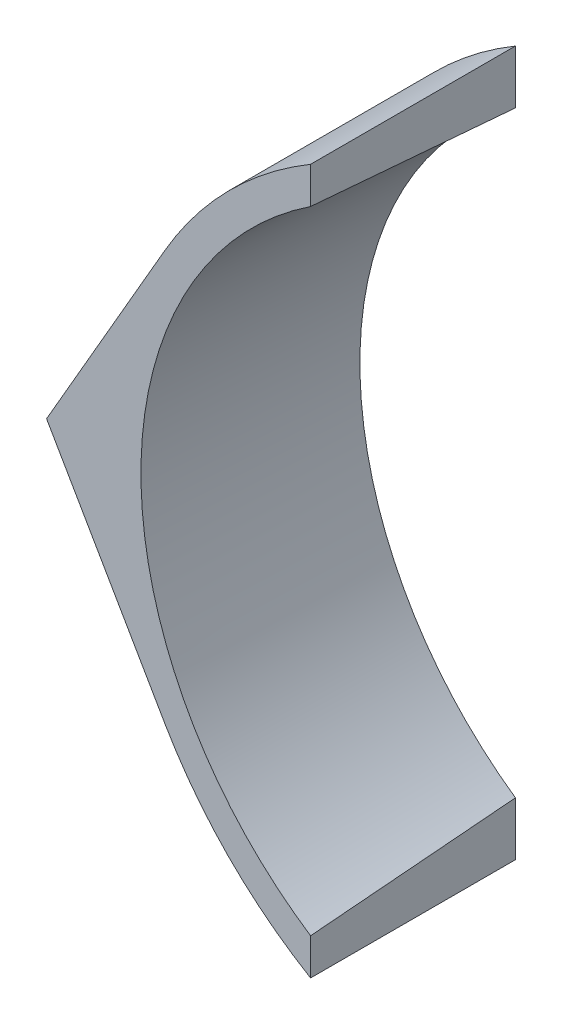
ISO-10303-21;
HEADER;
FILE_DESCRIPTION(('STEP AP214'),'2;1');
FILE_NAME('part.step','',(''),(''),'','','');
FILE_SCHEMA(('AUTOMOTIVE_DESIGN { 1 0 10303 214 1 1 1 1 }'));
ENDSEC;
DATA;
#1=APPLICATION_CONTEXT('core data for automotive mechanical design processes');
#2=APPLICATION_PROTOCOL_DEFINITION('international standard','automotive_design',2000,#1);
#3=PRODUCT_CONTEXT('',#1,'mechanical');
#4=PRODUCT('Part','Part','',(#3));
#5=PRODUCT_RELATED_PRODUCT_CATEGORY('part','',(#4));
#6=PRODUCT_DEFINITION_FORMATION('','',#4);
#7=PRODUCT_DEFINITION_CONTEXT('part definition',#1,'design');
#8=PRODUCT_DEFINITION('design','',#6,#7);
#9=PRODUCT_DEFINITION_SHAPE('','',#8);
#10=(LENGTH_UNIT() NAMED_UNIT(*) SI_UNIT(.MILLI.,.METRE.));
#11=(NAMED_UNIT(*) PLANE_ANGLE_UNIT() SI_UNIT($,.RADIAN.));
#12=(NAMED_UNIT(*) SI_UNIT($,.STERADIAN.) SOLID_ANGLE_UNIT());
#13=UNCERTAINTY_MEASURE_WITH_UNIT(LENGTH_MEASURE(1.E-05),#10,'distance_accuracy_value','');
#14=(GEOMETRIC_REPRESENTATION_CONTEXT(3) GLOBAL_UNCERTAINTY_ASSIGNED_CONTEXT((#13)) GLOBAL_UNIT_ASSIGNED_CONTEXT((#10,
#11,#12)) REPRESENTATION_CONTEXT('',''));
#15=CARTESIAN_POINT('',(0.,0.,0.));
#16=DIRECTION('',(0.,0.,1.));
#17=DIRECTION('',(1.,0.,0.));
#18=AXIS2_PLACEMENT_3D('',#15,#16,#17);
#19=CARTESIAN_POINT('',(12.1108877060605,0.,10.));
#20=DIRECTION('',(1.,0.,0.));
#21=DIRECTION('',(0.,0.,-1.));
#22=AXIS2_PLACEMENT_3D('',#19,#20,#21);
#23=PLANE('',#22);
#24=CARTESIAN_POINT('',(12.1108877060605,-16.2583992822124,20.3368691849878));
#25=CARTESIAN_POINT('',(12.1108877060605,-16.0510096867721,17.7802884825596));
#26=CARTESIAN_POINT('',(12.1108877060605,-15.8425218389667,15.2237965758103));
#27=CARTESIAN_POINT('',(12.1108877060605,-15.4230353738178,10.1110220411792));
#28=CARTESIAN_POINT('',(12.1108877060605,-15.2120367596224,7.55473941303884));
#29=CARTESIAN_POINT('',(12.1108877060605,-14.7872139306469,2.44240813730762));
#30=CARTESIAN_POINT('',(12.1108877060605,-14.5733897152309,-0.113640510230488));
#31=CARTESIAN_POINT('',(12.1108877060605,-14.1425009217361,-5.22546780915912));
#32=CARTESIAN_POINT('',(12.1108877060605,-13.9254363395909,-7.78124646020677));
#33=CARTESIAN_POINT('',(12.1108877060605,-13.7065444373449,-10.3368691849878));
#34=B_SPLINE_CURVE_WITH_KNOTS('',3,(#24,#25,#26,#27,#28,#29,#30,#31,#32,#33),.UNSPECIFIED.,.F.,
.F.,(4,2,2,2,4),(0.,7.69493604730184,15.3898624473817,23.0847905791901,30.7797283681075),.UNSPECIFIED.);
#35=CARTESIAN_POINT('',(12.1108877060605,-15.4134598395235,10.));
#36=VERTEX_POINT('',#35);
#37=CARTESIAN_POINT('',(12.1108877060605,-14.5823820642125,0.));
#38=VERTEX_POINT('',#37);
#39=EDGE_CURVE('E157',#36,#38,#34,.T.);
#40=ORIENTED_EDGE('',*,*,#39,.F.);
#41=DIRECTION('',(0.,-1.,0.));
#42=VECTOR('',#41,1.);
#43=CARTESIAN_POINT('',(12.1108877060605,0.,10.));
#44=LINE('',#43,#42);
#45=CARTESIAN_POINT('',(12.1108877060605,-17.1990077233155,10.));
#46=VERTEX_POINT('',#45);
#47=EDGE_CURVE('E82',#36,#46,#44,.T.);
#48=ORIENTED_EDGE('',*,*,#47,.T.);
#49=DIRECTION('',(0.,0.,-1.));
#50=VECTOR('',#49,1.);
#51=CARTESIAN_POINT('',(12.1108877060605,-17.1990077233155,10.));
#52=LINE('',#51,#50);
#53=CARTESIAN_POINT('',(12.1108877060605,-17.1990077233155,0.));
#54=VERTEX_POINT('',#53);
#55=EDGE_CURVE('E115',#46,#54,#52,.T.);
#56=ORIENTED_EDGE('',*,*,#55,.T.);
#57=DIRECTION('',(0.,-1.,0.));
#58=VECTOR('',#57,1.);
#59=CARTESIAN_POINT('',(12.1108877060605,0.,0.));
#60=LINE('',#59,#58);
#61=EDGE_CURVE('E154',#38,#54,#60,.T.);
#62=ORIENTED_EDGE('',*,*,#61,.F.);
#63=EDGE_LOOP('',(#40,#48,#56,#62));
#64=FACE_BOUND('',#63,.T.);
#65=ADVANCED_FACE('F70',(#64),#23,.T.);
#66=CARTESIAN_POINT('',(12.1108877060605,0.,10.));
#67=DIRECTION('',(1.,0.,0.));
#68=DIRECTION('',(0.,0.,-1.));
#69=AXIS2_PLACEMENT_3D('',#66,#67,#68);
#70=PLANE('',#69);
#71=CARTESIAN_POINT('',(12.1108877060605,13.7065444373449,-10.3368691849878));
#72=CARTESIAN_POINT('',(12.1108877060605,13.9254363395909,-7.78124646020678));
#73=CARTESIAN_POINT('',(12.1108877060605,14.1425009217361,-5.22546780915913));
#74=CARTESIAN_POINT('',(12.1108877060605,14.5733897152309,-0.113640510230496));
#75=CARTESIAN_POINT('',(12.1108877060605,14.7872139306469,2.44240813730761));
#76=CARTESIAN_POINT('',(12.1108877060605,15.2120367596224,7.55473941303883));
#77=CARTESIAN_POINT('',(12.1108877060605,15.4230353738178,10.1110220411791));
#78=CARTESIAN_POINT('',(12.1108877060605,15.8425218389667,15.2237965758103));
#79=CARTESIAN_POINT('',(12.1108877060605,16.0510096867721,17.7802884825596));
#80=CARTESIAN_POINT('',(12.1108877060605,16.2583992822124,20.3368691849878));
#81=B_SPLINE_CURVE_WITH_KNOTS('',3,(#71,#72,#73,#74,#75,#76,#77,#78,#79,#80),.UNSPECIFIED.,.F.,
.F.,(4,2,2,2,4),(0.,7.69493778891738,15.3898659207258,23.0847923208057,30.7797283681075),.UNSPECIFIED.);
#82=CARTESIAN_POINT('',(12.1108877060605,14.5823820642125,0.));
#83=VERTEX_POINT('',#82);
#84=CARTESIAN_POINT('',(12.1108877060605,15.4134598395235,10.));
#85=VERTEX_POINT('',#84);
#86=EDGE_CURVE('E195',#83,#85,#81,.T.);
#87=ORIENTED_EDGE('',*,*,#86,.F.);
#88=DIRECTION('',(0.,-1.,0.));
#89=VECTOR('',#88,1.);
#90=CARTESIAN_POINT('',(12.1108877060605,0.,0.));
#91=LINE('',#90,#89);
#92=CARTESIAN_POINT('',(12.1108877060605,17.1990077233155,0.));
#93=VERTEX_POINT('',#92);
#94=EDGE_CURVE('E165',#93,#83,#91,.T.);
#95=ORIENTED_EDGE('',*,*,#94,.F.);
#96=DIRECTION('',(0.,0.,-1.));
#97=VECTOR('',#96,1.);
#98=CARTESIAN_POINT('',(12.1108877060605,17.1990077233155,10.));
#99=LINE('',#98,#97);
#100=CARTESIAN_POINT('',(12.1108877060605,17.1990077233155,10.));
#101=VERTEX_POINT('',#100);
#102=EDGE_CURVE('E12',#101,#93,#99,.T.);
#103=ORIENTED_EDGE('',*,*,#102,.F.);
#104=DIRECTION('',(0.,-1.,0.));
#105=VECTOR('',#104,1.);
#106=CARTESIAN_POINT('',(12.1108877060605,0.,10.));
#107=LINE('',#106,#105);
#108=EDGE_CURVE('E147',#101,#85,#107,.T.);
#109=ORIENTED_EDGE('',*,*,#108,.T.);
#110=EDGE_LOOP('',(#87,#95,#103,#109));
#111=FACE_BOUND('',#110,.T.);
#112=ADVANCED_FACE('F214',(#111),#70,.T.);
#113=CARTESIAN_POINT('',(22.3184404653332,0.,10.));
#114=DIRECTION('',(0.,0.,-1.));
#115=DIRECTION('',(-1.,0.,0.));
#116=AXIS2_PLACEMENT_3D('',#113,#114,#115);
#117=CYLINDRICAL_SURFACE('',#116,20.);
#118=CARTESIAN_POINT('',(22.3184404653332,0.,0.));
#119=DIRECTION('',(0.,0.,1.));
#120=DIRECTION('',(1.,0.,0.));
#121=AXIS2_PLACEMENT_3D('',#118,#119,#120);
#122=CIRCLE('',#121,20.);
#123=CARTESIAN_POINT('',(4.99793238964435,9.99999999999995,0.));
#124=VERTEX_POINT('',#123);
#125=EDGE_CURVE('E164',#93,#124,#122,.T.);
#126=ORIENTED_EDGE('',*,*,#125,.T.);
#127=DIRECTION('',(0.,0.,-1.));
#128=VECTOR('',#127,1.);
#129=CARTESIAN_POINT('',(4.99793238964435,9.99999999999995,10.));
#130=LINE('',#129,#128);
#131=CARTESIAN_POINT('',(4.99793238964435,9.99999999999995,10.));
#132=VERTEX_POINT('',#131);
#133=EDGE_CURVE('E78',#132,#124,#130,.T.);
#134=ORIENTED_EDGE('',*,*,#133,.F.);
#135=CARTESIAN_POINT('',(22.3184404653332,0.,10.));
#136=DIRECTION('',(0.,0.,1.));
#137=DIRECTION('',(1.,0.,0.));
#138=AXIS2_PLACEMENT_3D('',#135,#136,#137);
#139=CIRCLE('',#138,20.);
#140=EDGE_CURVE('E150',#101,#132,#139,.T.);
#141=ORIENTED_EDGE('',*,*,#140,.F.);
#142=ORIENTED_EDGE('',*,*,#102,.T.);
#143=EDGE_LOOP('',(#126,#134,#141,#142));
#144=FACE_BOUND('',#143,.T.);
#145=ADVANCED_FACE('F171',(#144),#117,.T.);
#146=CARTESIAN_POINT('',(-0.581677726688885,0.335831792085434,10.));
#147=DIRECTION('',(-0.86602540378444,0.499999999999998,0.));
#148=DIRECTION('',(-0.499999999999998,-0.86602540378444,0.));
#149=AXIS2_PLACEMENT_3D('',#146,#147,#148);
#150=PLANE('',#149);
#151=DIRECTION('',(0.499999999999998,0.86602540378444,0.));
#152=VECTOR('',#151,1.);
#153=CARTESIAN_POINT('',(-0.581677726688885,0.335831792085434,0.));
#154=LINE('',#153,#152);
#155=CARTESIAN_POINT('',(-0.775570302251845,0.,0.));
#156=VERTEX_POINT('',#155);
#157=EDGE_CURVE('E131',#156,#124,#154,.T.);
#158=ORIENTED_EDGE('',*,*,#157,.F.);
#159=DIRECTION('',(0.,0.,-1.));
#160=VECTOR('',#159,1.);
#161=CARTESIAN_POINT('',(-0.775570302251845,0.,10.));
#162=LINE('',#161,#160);
#163=CARTESIAN_POINT('',(-0.775570302251845,0.,10.));
#164=VERTEX_POINT('',#163);
#165=EDGE_CURVE('E129',#164,#156,#162,.T.);
#166=ORIENTED_EDGE('',*,*,#165,.F.);
#167=DIRECTION('',(0.499999999999998,0.86602540378444,0.));
#168=VECTOR('',#167,1.);
#169=CARTESIAN_POINT('',(-0.581677726688885,0.335831792085434,10.));
#170=LINE('',#169,#168);
#171=EDGE_CURVE('E132',#164,#132,#170,.T.);
#172=ORIENTED_EDGE('',*,*,#171,.T.);
#173=ORIENTED_EDGE('',*,*,#133,.T.);
#174=EDGE_LOOP('',(#158,#166,#172,#173));
#175=FACE_BOUND('',#174,.T.);
#176=ADVANCED_FACE('F133',(#175),#150,.T.);
#177=CARTESIAN_POINT('',(-0.581677726688885,-0.335831792085434,10.));
#178=DIRECTION('',(0.86602540378444,0.499999999999998,0.));
#179=DIRECTION('',(-0.499999999999998,0.86602540378444,0.));
#180=AXIS2_PLACEMENT_3D('',#177,#178,#179);
#181=PLANE('',#180);
#182=DIRECTION('',(0.499999999999998,-0.86602540378444,0.));
#183=VECTOR('',#182,1.);
#184=CARTESIAN_POINT('',(-0.581677726688885,-0.335831792085434,0.));
#185=LINE('',#184,#183);
#186=CARTESIAN_POINT('',(4.99793238964435,-9.99999999999995,0.));
#187=VERTEX_POINT('',#186);
#188=EDGE_CURVE('E110',#156,#187,#185,.T.);
#189=ORIENTED_EDGE('',*,*,#188,.T.);
#190=DIRECTION('',(0.,0.,-1.));
#191=VECTOR('',#190,1.);
#192=CARTESIAN_POINT('',(4.99793238964435,-9.99999999999995,10.));
#193=LINE('',#192,#191);
#194=CARTESIAN_POINT('',(4.99793238964435,-9.99999999999995,10.));
#195=VERTEX_POINT('',#194);
#196=EDGE_CURVE('E136',#195,#187,#193,.T.);
#197=ORIENTED_EDGE('',*,*,#196,.F.);
#198=DIRECTION('',(0.499999999999998,-0.86602540378444,0.));
#199=VECTOR('',#198,1.);
#200=CARTESIAN_POINT('',(-0.581677726688885,-0.335831792085434,10.));
#201=LINE('',#200,#199);
#202=EDGE_CURVE('E138',#164,#195,#201,.T.);
#203=ORIENTED_EDGE('',*,*,#202,.F.);
#204=ORIENTED_EDGE('',*,*,#165,.T.);
#205=EDGE_LOOP('',(#189,#197,#203,#204));
#206=FACE_BOUND('',#205,.T.);
#207=ADVANCED_FACE('F137',(#206),#181,.F.);
#208=CARTESIAN_POINT('',(22.3184404653332,0.,10.));
#209=DIRECTION('',(0.,0.,-1.));
#210=DIRECTION('',(-1.,0.,0.));
#211=AXIS2_PLACEMENT_3D('',#208,#209,#210);
#212=CYLINDRICAL_SURFACE('',#211,20.);
#213=CARTESIAN_POINT('',(22.3184404653332,0.,0.));
#214=DIRECTION('',(0.,0.,1.));
#215=DIRECTION('',(1.,0.,0.));
#216=AXIS2_PLACEMENT_3D('',#213,#214,#215);
#217=CIRCLE('',#216,20.);
#218=EDGE_CURVE('E168',#187,#54,#217,.T.);
#219=ORIENTED_EDGE('',*,*,#218,.T.);
#220=ORIENTED_EDGE('',*,*,#55,.F.);
#221=CARTESIAN_POINT('',(22.3184404653332,0.,10.));
#222=DIRECTION('',(0.,0.,1.));
#223=DIRECTION('',(1.,0.,0.));
#224=AXIS2_PLACEMENT_3D('',#221,#222,#223);
#225=CIRCLE('',#224,20.);
#226=EDGE_CURVE('E142',#195,#46,#225,.T.);
#227=ORIENTED_EDGE('',*,*,#226,.F.);
#228=ORIENTED_EDGE('',*,*,#196,.T.);
#229=EDGE_LOOP('',(#219,#220,#227,#228));
#230=FACE_BOUND('',#229,.T.);
#231=ADVANCED_FACE('F179',(#230),#212,.T.);
#232=CARTESIAN_POINT('',(0.,0.,10.));
#233=DIRECTION('',(0.,0.,1.));
#234=DIRECTION('',(1.,0.,0.));
#235=AXIS2_PLACEMENT_3D('',#232,#233,#234);
#236=PLANE('',#235);
#237=CARTESIAN_POINT('',(22.3184404653332,0.,10.));
#238=DIRECTION('',(0.,0.,1.));
#239=DIRECTION('',(1.,0.,0.));
#240=AXIS2_PLACEMENT_3D('',#237,#238,#239);
#241=CIRCLE('',#240,18.4869921176469);
#242=EDGE_CURVE('E181',#85,#36,#241,.T.);
#243=ORIENTED_EDGE('',*,*,#242,.F.);
#244=ORIENTED_EDGE('',*,*,#108,.F.);
#245=ORIENTED_EDGE('',*,*,#140,.T.);
#246=ORIENTED_EDGE('',*,*,#171,.F.);
#247=ORIENTED_EDGE('',*,*,#202,.T.);
#248=ORIENTED_EDGE('',*,*,#226,.T.);
#249=ORIENTED_EDGE('',*,*,#47,.F.);
#250=EDGE_LOOP('',(#243,#244,#245,#246,#247,#248,#249));
#251=FACE_BOUND('',#250,.T.);
#252=ADVANCED_FACE('F144',(#251),#236,.T.);
#253=CARTESIAN_POINT('',(0.,0.,0.));
#254=DIRECTION('',(0.,0.,1.));
#255=DIRECTION('',(1.,0.,0.));
#256=AXIS2_PLACEMENT_3D('',#253,#254,#255);
#257=PLANE('',#256);
#258=ORIENTED_EDGE('',*,*,#61,.T.);
#259=ORIENTED_EDGE('',*,*,#218,.F.);
#260=ORIENTED_EDGE('',*,*,#188,.F.);
#261=ORIENTED_EDGE('',*,*,#157,.T.);
#262=ORIENTED_EDGE('',*,*,#125,.F.);
#263=ORIENTED_EDGE('',*,*,#94,.T.);
#264=CARTESIAN_POINT('',(22.3184404653332,0.,0.));
#265=DIRECTION('',(0.,0.,1.));
#266=DIRECTION('',(1.,0.,0.));
#267=AXIS2_PLACEMENT_3D('',#264,#265,#266);
#268=CIRCLE('',#267,17.8);
#269=EDGE_CURVE('E158',#83,#38,#268,.T.);
#270=ORIENTED_EDGE('',*,*,#269,.T.);
#271=EDGE_LOOP('',(#258,#259,#260,#261,#262,#263,#270));
#272=FACE_BOUND('',#271,.T.);
#273=ADVANCED_FACE('F180',(#272),#257,.F.);
#274=CARTESIAN_POINT('',(22.3184404653332,0.,10.));
#275=DIRECTION('',(0.,0.,1.));
#276=DIRECTION('',(1.,0.,0.));
#277=AXIS2_PLACEMENT_3D('',#274,#275,#276);
#278=CONICAL_SURFACE('',#277,18.4869921176469,0.0685914396033703);
#279=ORIENTED_EDGE('',*,*,#39,.T.);
#280=ORIENTED_EDGE('',*,*,#269,.F.);
#281=ORIENTED_EDGE('',*,*,#86,.T.);
#282=ORIENTED_EDGE('',*,*,#242,.T.);
#283=EDGE_LOOP('',(#279,#280,#281,#282));
#284=FACE_BOUND('',#283,.T.);
#285=ADVANCED_FACE('F196',(#284),#278,.F.);
#286=CLOSED_SHELL('',(#65,#112,#145,#176,#207,#231,#252,#273,#285));
#287=MANIFOLD_SOLID_BREP('B2',#286);
#288=ADVANCED_BREP_SHAPE_REPRESENTATION('',(#18,#287),#14);
#289=SHAPE_DEFINITION_REPRESENTATION(#9,#288);
ENDSEC;
END-ISO-10303-21;
